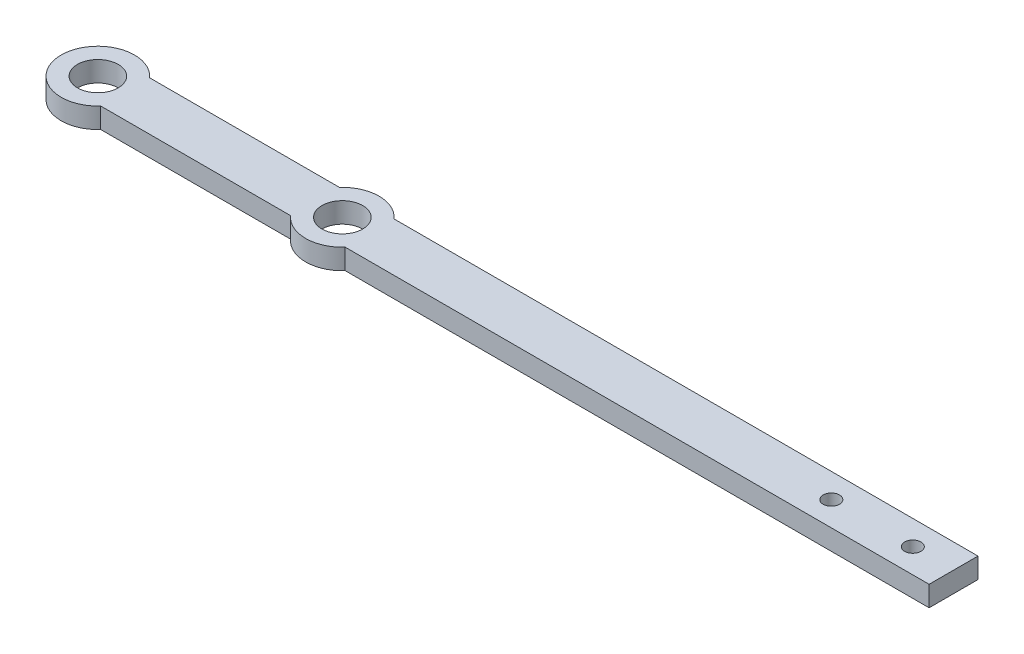
ISO-10303-21;
HEADER;
FILE_DESCRIPTION(('STEP AP214'),'2;1');
FILE_NAME('part.step','',(''),(''),'','','');
FILE_SCHEMA(('AUTOMOTIVE_DESIGN { 1 0 10303 214 1 1 1 1 }'));
ENDSEC;
DATA;
#1=APPLICATION_CONTEXT('core data for automotive mechanical design processes');
#2=APPLICATION_PROTOCOL_DEFINITION('international standard','automotive_design',2000,#1);
#3=PRODUCT_CONTEXT('',#1,'mechanical');
#4=PRODUCT('Part','Part','',(#3));
#5=PRODUCT_RELATED_PRODUCT_CATEGORY('part','',(#4));
#6=PRODUCT_DEFINITION_FORMATION('','',#4);
#7=PRODUCT_DEFINITION_CONTEXT('part definition',#1,'design');
#8=PRODUCT_DEFINITION('design','',#6,#7);
#9=PRODUCT_DEFINITION_SHAPE('','',#8);
#10=(LENGTH_UNIT() NAMED_UNIT(*) SI_UNIT(.MILLI.,.METRE.));
#11=(NAMED_UNIT(*) PLANE_ANGLE_UNIT() SI_UNIT($,.RADIAN.));
#12=(NAMED_UNIT(*) SI_UNIT($,.STERADIAN.) SOLID_ANGLE_UNIT());
#13=UNCERTAINTY_MEASURE_WITH_UNIT(LENGTH_MEASURE(1.E-05),#10,'distance_accuracy_value','');
#14=(GEOMETRIC_REPRESENTATION_CONTEXT(3) GLOBAL_UNCERTAINTY_ASSIGNED_CONTEXT((#13)) GLOBAL_UNIT_ASSIGNED_CONTEXT((#10,
#11,#12)) REPRESENTATION_CONTEXT('',''));
#15=CARTESIAN_POINT('',(0.,0.,0.));
#16=DIRECTION('',(0.,0.,1.));
#17=DIRECTION('',(1.,0.,0.));
#18=AXIS2_PLACEMENT_3D('',#15,#16,#17);
#19=CARTESIAN_POINT('',(60.,5.,0.));
#20=DIRECTION('',(0.,-1.,0.));
#21=DIRECTION('',(0.,0.,-1.));
#22=AXIS2_PLACEMENT_3D('',#19,#20,#21);
#23=CYLINDRICAL_SURFACE('',#22,9.);
#24=CARTESIAN_POINT('',(60.,0.,0.));
#25=DIRECTION('',(0.,1.,0.));
#26=DIRECTION('',(0.,0.,1.));
#27=AXIS2_PLACEMENT_3D('',#24,#25,#26);
#28=CIRCLE('',#27,9.);
#29=CARTESIAN_POINT('',(53.2917960675006,0.,6.));
#30=VERTEX_POINT('',#29);
#31=CARTESIAN_POINT('',(66.7082039324994,0.,6.));
#32=VERTEX_POINT('',#31);
#33=EDGE_CURVE('E146',#30,#32,#28,.T.);
#34=ORIENTED_EDGE('',*,*,#33,.T.);
#35=DIRECTION('',(0.,-1.,0.));
#36=VECTOR('',#35,1.);
#37=CARTESIAN_POINT('',(66.7082039324994,5.,6.));
#38=LINE('',#37,#36);
#39=CARTESIAN_POINT('',(66.7082039324994,5.,6.));
#40=VERTEX_POINT('',#39);
#41=EDGE_CURVE('E11',#40,#32,#38,.T.);
#42=ORIENTED_EDGE('',*,*,#41,.F.);
#43=CARTESIAN_POINT('',(60.,5.,0.));
#44=DIRECTION('',(0.,1.,0.));
#45=DIRECTION('',(0.,0.,1.));
#46=AXIS2_PLACEMENT_3D('',#43,#44,#45);
#47=CIRCLE('',#46,9.);
#48=CARTESIAN_POINT('',(53.2917960675006,5.,6.));
#49=VERTEX_POINT('',#48);
#50=EDGE_CURVE('E169',#49,#40,#47,.T.);
#51=ORIENTED_EDGE('',*,*,#50,.F.);
#52=DIRECTION('',(0.,-1.,0.));
#53=VECTOR('',#52,1.);
#54=CARTESIAN_POINT('',(53.2917960675006,5.,6.));
#55=LINE('',#54,#53);
#56=EDGE_CURVE('E142',#49,#30,#55,.T.);
#57=ORIENTED_EDGE('',*,*,#56,.T.);
#58=EDGE_LOOP('',(#34,#42,#51,#57));
#59=FACE_BOUND('',#58,.T.);
#60=ADVANCED_FACE('F45',(#59),#23,.T.);
#61=CARTESIAN_POINT('',(210.,5.,6.));
#62=DIRECTION('',(0.,0.,-1.));
#63=DIRECTION('',(-1.,0.,0.));
#64=AXIS2_PLACEMENT_3D('',#61,#62,#63);
#65=PLANE('',#64);
#66=DIRECTION('',(1.,0.,0.));
#67=VECTOR('',#66,1.);
#68=CARTESIAN_POINT('',(210.,0.,6.));
#69=LINE('',#68,#67);
#70=CARTESIAN_POINT('',(210.,0.,6.));
#71=VERTEX_POINT('',#70);
#72=EDGE_CURVE('E150',#32,#71,#69,.T.);
#73=ORIENTED_EDGE('',*,*,#72,.T.);
#74=DIRECTION('',(0.,-1.,0.));
#75=VECTOR('',#74,1.);
#76=CARTESIAN_POINT('',(210.,5.,6.));
#77=LINE('',#76,#75);
#78=CARTESIAN_POINT('',(210.,5.,6.));
#79=VERTEX_POINT('',#78);
#80=EDGE_CURVE('E54',#79,#71,#77,.T.);
#81=ORIENTED_EDGE('',*,*,#80,.F.);
#82=DIRECTION('',(1.,0.,0.));
#83=VECTOR('',#82,1.);
#84=CARTESIAN_POINT('',(210.,5.,6.));
#85=LINE('',#84,#83);
#86=EDGE_CURVE('E105',#40,#79,#85,.T.);
#87=ORIENTED_EDGE('',*,*,#86,.F.);
#88=ORIENTED_EDGE('',*,*,#41,.T.);
#89=EDGE_LOOP('',(#73,#81,#87,#88));
#90=FACE_BOUND('',#89,.T.);
#91=ADVANCED_FACE('F279',(#90),#65,.F.);
#92=CARTESIAN_POINT('',(210.,5.,-6.));
#93=DIRECTION('',(-1.,0.,0.));
#94=DIRECTION('',(0.,0.,1.));
#95=AXIS2_PLACEMENT_3D('',#92,#93,#94);
#96=PLANE('',#95);
#97=DIRECTION('',(0.,0.,-1.));
#98=VECTOR('',#97,1.);
#99=CARTESIAN_POINT('',(210.,0.,-6.));
#100=LINE('',#99,#98);
#101=CARTESIAN_POINT('',(210.,0.,-6.));
#102=VERTEX_POINT('',#101);
#103=EDGE_CURVE('E154',#71,#102,#100,.T.);
#104=ORIENTED_EDGE('',*,*,#103,.T.);
#105=DIRECTION('',(0.,-1.,0.));
#106=VECTOR('',#105,1.);
#107=CARTESIAN_POINT('',(210.,5.,-6.));
#108=LINE('',#107,#106);
#109=CARTESIAN_POINT('',(210.,5.,-6.));
#110=VERTEX_POINT('',#109);
#111=EDGE_CURVE('E180',#110,#102,#108,.T.);
#112=ORIENTED_EDGE('',*,*,#111,.F.);
#113=DIRECTION('',(0.,0.,-1.));
#114=VECTOR('',#113,1.);
#115=CARTESIAN_POINT('',(210.,5.,-6.));
#116=LINE('',#115,#114);
#117=EDGE_CURVE('E190',#79,#110,#116,.T.);
#118=ORIENTED_EDGE('',*,*,#117,.F.);
#119=ORIENTED_EDGE('',*,*,#80,.T.);
#120=EDGE_LOOP('',(#104,#112,#118,#119));
#121=FACE_BOUND('',#120,.T.);
#122=ADVANCED_FACE('F188',(#121),#96,.F.);
#123=CARTESIAN_POINT('',(66.7082039324994,5.,-6.));
#124=DIRECTION('',(0.,0.,1.));
#125=DIRECTION('',(1.,0.,0.));
#126=AXIS2_PLACEMENT_3D('',#123,#124,#125);
#127=PLANE('',#126);
#128=DIRECTION('',(-1.,0.,0.));
#129=VECTOR('',#128,1.);
#130=CARTESIAN_POINT('',(66.7082039324994,0.,-6.));
#131=LINE('',#130,#129);
#132=CARTESIAN_POINT('',(66.7082039324994,0.,-6.));
#133=VERTEX_POINT('',#132);
#134=EDGE_CURVE('E157',#102,#133,#131,.T.);
#135=ORIENTED_EDGE('',*,*,#134,.T.);
#136=DIRECTION('',(0.,-1.,0.));
#137=VECTOR('',#136,1.);
#138=CARTESIAN_POINT('',(66.7082039324994,5.,-6.));
#139=LINE('',#138,#137);
#140=CARTESIAN_POINT('',(66.7082039324994,5.,-6.));
#141=VERTEX_POINT('',#140);
#142=EDGE_CURVE('E176',#141,#133,#139,.T.);
#143=ORIENTED_EDGE('',*,*,#142,.F.);
#144=DIRECTION('',(-1.,0.,0.));
#145=VECTOR('',#144,1.);
#146=CARTESIAN_POINT('',(66.7082039324994,5.,-6.));
#147=LINE('',#146,#145);
#148=EDGE_CURVE('E203',#110,#141,#147,.T.);
#149=ORIENTED_EDGE('',*,*,#148,.F.);
#150=ORIENTED_EDGE('',*,*,#111,.T.);
#151=EDGE_LOOP('',(#135,#143,#149,#150));
#152=FACE_BOUND('',#151,.T.);
#153=ADVANCED_FACE('F198',(#152),#127,.F.);
#154=CARTESIAN_POINT('',(60.,5.,0.));
#155=DIRECTION('',(0.,-1.,0.));
#156=DIRECTION('',(0.,0.,-1.));
#157=AXIS2_PLACEMENT_3D('',#154,#155,#156);
#158=CYLINDRICAL_SURFACE('',#157,9.);
#159=CARTESIAN_POINT('',(60.,0.,0.));
#160=DIRECTION('',(0.,1.,0.));
#161=DIRECTION('',(0.,0.,1.));
#162=AXIS2_PLACEMENT_3D('',#159,#160,#161);
#163=CIRCLE('',#162,9.);
#164=CARTESIAN_POINT('',(53.2917960675006,0.,-6.));
#165=VERTEX_POINT('',#164);
#166=EDGE_CURVE('E160',#133,#165,#163,.T.);
#167=ORIENTED_EDGE('',*,*,#166,.T.);
#168=DIRECTION('',(0.,-1.,0.));
#169=VECTOR('',#168,1.);
#170=CARTESIAN_POINT('',(53.2917960675006,5.,-6.));
#171=LINE('',#170,#169);
#172=CARTESIAN_POINT('',(53.2917960675006,5.,-6.));
#173=VERTEX_POINT('',#172);
#174=EDGE_CURVE('E135',#173,#165,#171,.T.);
#175=ORIENTED_EDGE('',*,*,#174,.F.);
#176=CARTESIAN_POINT('',(60.,5.,0.));
#177=DIRECTION('',(0.,1.,0.));
#178=DIRECTION('',(0.,0.,1.));
#179=AXIS2_PLACEMENT_3D('',#176,#177,#178);
#180=CIRCLE('',#179,9.);
#181=EDGE_CURVE('E124',#141,#173,#180,.T.);
#182=ORIENTED_EDGE('',*,*,#181,.F.);
#183=ORIENTED_EDGE('',*,*,#142,.T.);
#184=EDGE_LOOP('',(#167,#175,#182,#183));
#185=FACE_BOUND('',#184,.T.);
#186=ADVANCED_FACE('F201',(#185),#158,.T.);
#187=CARTESIAN_POINT('',(6.70820393249937,5.,-6.));
#188=DIRECTION('',(0.,0.,1.));
#189=DIRECTION('',(1.,0.,0.));
#190=AXIS2_PLACEMENT_3D('',#187,#188,#189);
#191=PLANE('',#190);
#192=DIRECTION('',(-1.,0.,0.));
#193=VECTOR('',#192,1.);
#194=CARTESIAN_POINT('',(6.70820393249937,0.,-6.));
#195=LINE('',#194,#193);
#196=CARTESIAN_POINT('',(6.70820393249937,0.,-6.));
#197=VERTEX_POINT('',#196);
#198=EDGE_CURVE('E133',#165,#197,#195,.T.);
#199=ORIENTED_EDGE('',*,*,#198,.T.);
#200=DIRECTION('',(0.,-1.,0.));
#201=VECTOR('',#200,1.);
#202=CARTESIAN_POINT('',(6.70820393249937,5.,-6.));
#203=LINE('',#202,#201);
#204=CARTESIAN_POINT('',(6.70820393249937,5.,-6.));
#205=VERTEX_POINT('',#204);
#206=EDGE_CURVE('E130',#205,#197,#203,.T.);
#207=ORIENTED_EDGE('',*,*,#206,.F.);
#208=DIRECTION('',(-1.,0.,0.));
#209=VECTOR('',#208,1.);
#210=CARTESIAN_POINT('',(6.70820393249937,5.,-6.));
#211=LINE('',#210,#209);
#212=EDGE_CURVE('E118',#173,#205,#211,.T.);
#213=ORIENTED_EDGE('',*,*,#212,.F.);
#214=ORIENTED_EDGE('',*,*,#174,.T.);
#215=EDGE_LOOP('',(#199,#207,#213,#214));
#216=FACE_BOUND('',#215,.T.);
#217=ADVANCED_FACE('F131',(#216),#191,.F.);
#218=CARTESIAN_POINT('',(0.,5.,0.));
#219=DIRECTION('',(0.,-1.,0.));
#220=DIRECTION('',(0.,0.,-1.));
#221=AXIS2_PLACEMENT_3D('',#218,#219,#220);
#222=CYLINDRICAL_SURFACE('',#221,9.);
#223=CARTESIAN_POINT('',(0.,0.,0.));
#224=DIRECTION('',(0.,1.,0.));
#225=DIRECTION('',(0.,0.,1.));
#226=AXIS2_PLACEMENT_3D('',#223,#224,#225);
#227=CIRCLE('',#226,9.);
#228=CARTESIAN_POINT('',(6.70820393249937,0.,6.));
#229=VERTEX_POINT('',#228);
#230=EDGE_CURVE('E91',#197,#229,#227,.T.);
#231=ORIENTED_EDGE('',*,*,#230,.T.);
#232=DIRECTION('',(0.,-1.,0.));
#233=VECTOR('',#232,1.);
#234=CARTESIAN_POINT('',(6.70820393249937,5.,6.));
#235=LINE('',#234,#233);
#236=CARTESIAN_POINT('',(6.70820393249937,5.,6.));
#237=VERTEX_POINT('',#236);
#238=EDGE_CURVE('E136',#237,#229,#235,.T.);
#239=ORIENTED_EDGE('',*,*,#238,.F.);
#240=CARTESIAN_POINT('',(0.,5.,0.));
#241=DIRECTION('',(0.,1.,0.));
#242=DIRECTION('',(0.,0.,1.));
#243=AXIS2_PLACEMENT_3D('',#240,#241,#242);
#244=CIRCLE('',#243,9.);
#245=EDGE_CURVE('E122',#205,#237,#244,.T.);
#246=ORIENTED_EDGE('',*,*,#245,.F.);
#247=ORIENTED_EDGE('',*,*,#206,.T.);
#248=EDGE_LOOP('',(#231,#239,#246,#247));
#249=FACE_BOUND('',#248,.T.);
#250=ADVANCED_FACE('F138',(#249),#222,.T.);
#251=CARTESIAN_POINT('',(6.70820393249937,5.,6.));
#252=DIRECTION('',(0.,0.,-1.));
#253=DIRECTION('',(-1.,0.,0.));
#254=AXIS2_PLACEMENT_3D('',#251,#252,#253);
#255=PLANE('',#254);
#256=DIRECTION('',(1.,0.,0.));
#257=VECTOR('',#256,1.);
#258=CARTESIAN_POINT('',(6.70820393249937,0.,6.));
#259=LINE('',#258,#257);
#260=EDGE_CURVE('E97',#229,#30,#259,.T.);
#261=ORIENTED_EDGE('',*,*,#260,.T.);
#262=ORIENTED_EDGE('',*,*,#56,.F.);
#263=DIRECTION('',(1.,0.,0.));
#264=VECTOR('',#263,1.);
#265=CARTESIAN_POINT('',(6.70820393249937,5.,6.));
#266=LINE('',#265,#264);
#267=EDGE_CURVE('E62',#237,#49,#266,.T.);
#268=ORIENTED_EDGE('',*,*,#267,.F.);
#269=ORIENTED_EDGE('',*,*,#238,.T.);
#270=EDGE_LOOP('',(#261,#262,#268,#269));
#271=FACE_BOUND('',#270,.T.);
#272=ADVANCED_FACE('F256',(#271),#255,.F.);
#273=CARTESIAN_POINT('',(60.,5.,0.));
#274=DIRECTION('',(0.,1.,0.));
#275=DIRECTION('',(0.,0.,1.));
#276=AXIS2_PLACEMENT_3D('',#273,#274,#275);
#277=PLANE('',#276);
#278=CARTESIAN_POINT('',(0.,5.,0.));
#279=DIRECTION('',(0.,1.,0.));
#280=DIRECTION('',(0.,0.,1.));
#281=AXIS2_PLACEMENT_3D('',#278,#279,#280);
#282=CIRCLE('',#281,5.);
#283=CARTESIAN_POINT('',(0.,5.,5.));
#284=VERTEX_POINT('',#283);
#285=EDGE_CURVE('E230',#284,#284,#282,.T.);
#286=ORIENTED_EDGE('',*,*,#285,.F.);
#287=EDGE_LOOP('',(#286));
#288=FACE_BOUND('',#287,.T.);
#289=CARTESIAN_POINT('',(180.,5.,0.));
#290=DIRECTION('',(0.,1.,0.));
#291=DIRECTION('',(0.,0.,1.));
#292=AXIS2_PLACEMENT_3D('',#289,#290,#291);
#293=CIRCLE('',#292,2.);
#294=CARTESIAN_POINT('',(180.,5.,2.));
#295=VERTEX_POINT('',#294);
#296=EDGE_CURVE('E218',#295,#295,#293,.T.);
#297=ORIENTED_EDGE('',*,*,#296,.F.);
#298=EDGE_LOOP('',(#297));
#299=FACE_BOUND('',#298,.T.);
#300=CARTESIAN_POINT('',(200.,5.,0.));
#301=DIRECTION('',(0.,1.,0.));
#302=DIRECTION('',(0.,0.,1.));
#303=AXIS2_PLACEMENT_3D('',#300,#301,#302);
#304=CIRCLE('',#303,2.);
#305=CARTESIAN_POINT('',(200.,5.,2.));
#306=VERTEX_POINT('',#305);
#307=EDGE_CURVE('E217',#306,#306,#304,.T.);
#308=ORIENTED_EDGE('',*,*,#307,.F.);
#309=EDGE_LOOP('',(#308));
#310=FACE_BOUND('',#309,.T.);
#311=CARTESIAN_POINT('',(60.,5.,0.));
#312=DIRECTION('',(0.,1.,0.));
#313=DIRECTION('',(0.,0.,1.));
#314=AXIS2_PLACEMENT_3D('',#311,#312,#313);
#315=CIRCLE('',#314,5.);
#316=CARTESIAN_POINT('',(60.,5.,5.));
#317=VERTEX_POINT('',#316);
#318=EDGE_CURVE('E226',#317,#317,#315,.T.);
#319=ORIENTED_EDGE('',*,*,#318,.F.);
#320=EDGE_LOOP('',(#319));
#321=FACE_BOUND('',#320,.T.);
#322=ORIENTED_EDGE('',*,*,#50,.T.);
#323=ORIENTED_EDGE('',*,*,#86,.T.);
#324=ORIENTED_EDGE('',*,*,#117,.T.);
#325=ORIENTED_EDGE('',*,*,#148,.T.);
#326=ORIENTED_EDGE('',*,*,#181,.T.);
#327=ORIENTED_EDGE('',*,*,#212,.T.);
#328=ORIENTED_EDGE('',*,*,#245,.T.);
#329=ORIENTED_EDGE('',*,*,#267,.T.);
#330=EDGE_LOOP('',(#322,#323,#324,#325,#326,#327,#328,#329));
#331=FACE_BOUND('',#330,.T.);
#332=ADVANCED_FACE('F120',(#288,#299,#310,#321,#331),#277,.T.);
#333=CARTESIAN_POINT('',(60.,0.,0.));
#334=DIRECTION('',(0.,1.,0.));
#335=DIRECTION('',(0.,0.,1.));
#336=AXIS2_PLACEMENT_3D('',#333,#334,#335);
#337=PLANE('',#336);
#338=CARTESIAN_POINT('',(0.,0.,0.));
#339=DIRECTION('',(0.,1.,0.));
#340=DIRECTION('',(0.,0.,1.));
#341=AXIS2_PLACEMENT_3D('',#338,#339,#340);
#342=CIRCLE('',#341,5.);
#343=CARTESIAN_POINT('',(0.,0.,5.));
#344=VERTEX_POINT('',#343);
#345=EDGE_CURVE('E151',#344,#344,#342,.T.);
#346=ORIENTED_EDGE('',*,*,#345,.T.);
#347=EDGE_LOOP('',(#346));
#348=FACE_BOUND('',#347,.T.);
#349=CARTESIAN_POINT('',(180.,0.,0.));
#350=DIRECTION('',(0.,1.,0.));
#351=DIRECTION('',(0.,0.,1.));
#352=AXIS2_PLACEMENT_3D('',#349,#350,#351);
#353=CIRCLE('',#352,2.);
#354=CARTESIAN_POINT('',(180.,0.,2.));
#355=VERTEX_POINT('',#354);
#356=EDGE_CURVE('E231',#355,#355,#353,.T.);
#357=ORIENTED_EDGE('',*,*,#356,.T.);
#358=EDGE_LOOP('',(#357));
#359=FACE_BOUND('',#358,.T.);
#360=CARTESIAN_POINT('',(200.,0.,0.));
#361=DIRECTION('',(0.,1.,0.));
#362=DIRECTION('',(0.,0.,1.));
#363=AXIS2_PLACEMENT_3D('',#360,#361,#362);
#364=CIRCLE('',#363,2.);
#365=CARTESIAN_POINT('',(200.,0.,2.));
#366=VERTEX_POINT('',#365);
#367=EDGE_CURVE('E213',#366,#366,#364,.T.);
#368=ORIENTED_EDGE('',*,*,#367,.T.);
#369=EDGE_LOOP('',(#368));
#370=FACE_BOUND('',#369,.T.);
#371=CARTESIAN_POINT('',(60.,0.,0.));
#372=DIRECTION('',(0.,1.,0.));
#373=DIRECTION('',(0.,0.,1.));
#374=AXIS2_PLACEMENT_3D('',#371,#372,#373);
#375=CIRCLE('',#374,5.);
#376=CARTESIAN_POINT('',(60.,0.,5.));
#377=VERTEX_POINT('',#376);
#378=EDGE_CURVE('E222',#377,#377,#375,.T.);
#379=ORIENTED_EDGE('',*,*,#378,.T.);
#380=EDGE_LOOP('',(#379));
#381=FACE_BOUND('',#380,.T.);
#382=ORIENTED_EDGE('',*,*,#33,.F.);
#383=ORIENTED_EDGE('',*,*,#260,.F.);
#384=ORIENTED_EDGE('',*,*,#230,.F.);
#385=ORIENTED_EDGE('',*,*,#198,.F.);
#386=ORIENTED_EDGE('',*,*,#166,.F.);
#387=ORIENTED_EDGE('',*,*,#134,.F.);
#388=ORIENTED_EDGE('',*,*,#103,.F.);
#389=ORIENTED_EDGE('',*,*,#72,.F.);
#390=EDGE_LOOP('',(#382,#383,#384,#385,#386,#387,#388,#389));
#391=FACE_BOUND('',#390,.T.);
#392=ADVANCED_FACE('F194',(#348,#359,#370,#381,#391),#337,.F.);
#393=CARTESIAN_POINT('',(60.,0.,0.));
#394=DIRECTION('',(0.,1.,0.));
#395=DIRECTION('',(0.,0.,1.));
#396=AXIS2_PLACEMENT_3D('',#393,#394,#395);
#397=CYLINDRICAL_SURFACE('',#396,5.);
#398=ORIENTED_EDGE('',*,*,#378,.F.);
#399=EDGE_LOOP('',(#398));
#400=FACE_BOUND('',#399,.T.);
#401=ORIENTED_EDGE('',*,*,#318,.T.);
#402=EDGE_LOOP('',(#401));
#403=FACE_BOUND('',#402,.T.);
#404=ADVANCED_FACE('F264',(#400,#403),#397,.F.);
#405=CARTESIAN_POINT('',(200.,0.,0.));
#406=DIRECTION('',(0.,1.,0.));
#407=DIRECTION('',(0.,0.,1.));
#408=AXIS2_PLACEMENT_3D('',#405,#406,#407);
#409=CYLINDRICAL_SURFACE('',#408,2.);
#410=ORIENTED_EDGE('',*,*,#367,.F.);
#411=EDGE_LOOP('',(#410));
#412=FACE_BOUND('',#411,.T.);
#413=ORIENTED_EDGE('',*,*,#307,.T.);
#414=EDGE_LOOP('',(#413));
#415=FACE_BOUND('',#414,.T.);
#416=ADVANCED_FACE('F266',(#412,#415),#409,.F.);
#417=CARTESIAN_POINT('',(180.,0.,0.));
#418=DIRECTION('',(0.,1.,0.));
#419=DIRECTION('',(0.,0.,1.));
#420=AXIS2_PLACEMENT_3D('',#417,#418,#419);
#421=CYLINDRICAL_SURFACE('',#420,2.);
#422=ORIENTED_EDGE('',*,*,#356,.F.);
#423=EDGE_LOOP('',(#422));
#424=FACE_BOUND('',#423,.T.);
#425=ORIENTED_EDGE('',*,*,#296,.T.);
#426=EDGE_LOOP('',(#425));
#427=FACE_BOUND('',#426,.T.);
#428=ADVANCED_FACE('F250',(#424,#427),#421,.F.);
#429=CARTESIAN_POINT('',(0.,0.,0.));
#430=DIRECTION('',(0.,1.,0.));
#431=DIRECTION('',(0.,0.,1.));
#432=AXIS2_PLACEMENT_3D('',#429,#430,#431);
#433=CYLINDRICAL_SURFACE('',#432,5.);
#434=ORIENTED_EDGE('',*,*,#345,.F.);
#435=EDGE_LOOP('',(#434));
#436=FACE_BOUND('',#435,.T.);
#437=ORIENTED_EDGE('',*,*,#285,.T.);
#438=EDGE_LOOP('',(#437));
#439=FACE_BOUND('',#438,.T.);
#440=ADVANCED_FACE('F247',(#436,#439),#433,.F.);
#441=CLOSED_SHELL('',(#60,#91,#122,#153,#186,#217,#250,#272,#332,#392,#404,#416,#428,#440));
#442=MANIFOLD_SOLID_BREP('B2',#441);
#443=ADVANCED_BREP_SHAPE_REPRESENTATION('',(#18,#442),#14);
#444=SHAPE_DEFINITION_REPRESENTATION(#9,#443);
ENDSEC;
END-ISO-10303-21;
